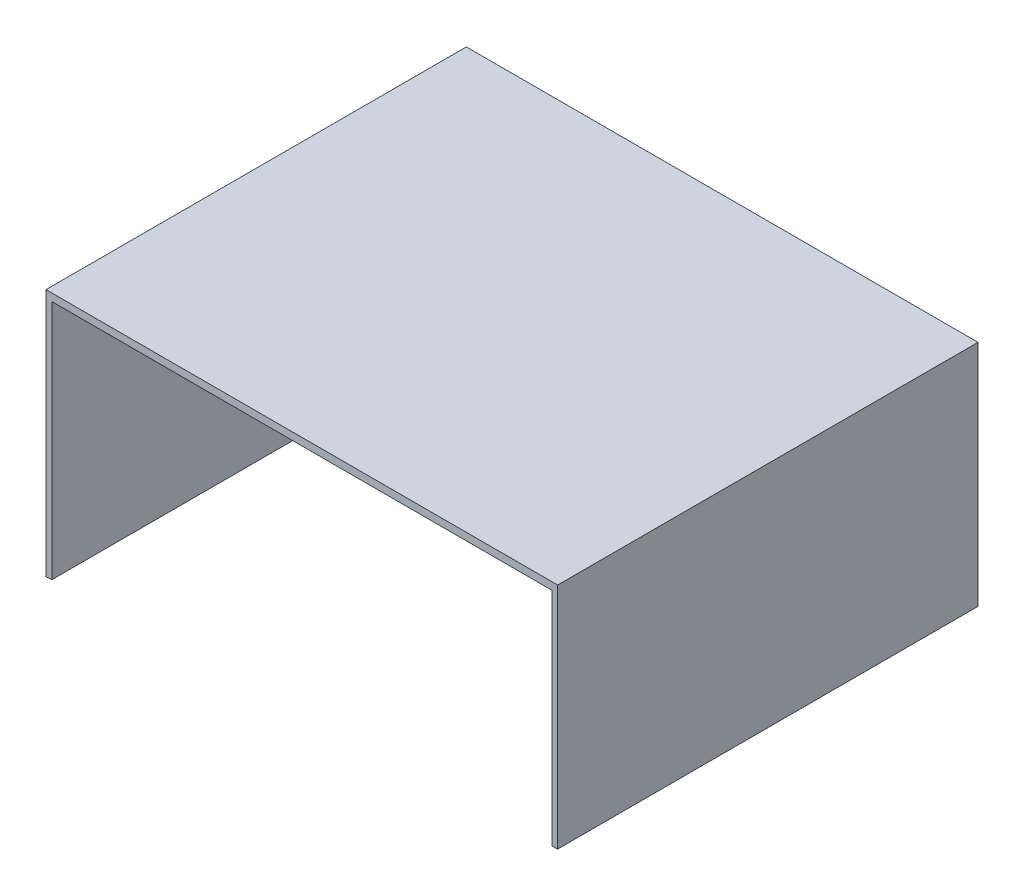
ISO-10303-21;
HEADER;
FILE_DESCRIPTION(('STEP AP214'),'2;1');
FILE_NAME('part.step','',(''),(''),'','','');
FILE_SCHEMA(('AUTOMOTIVE_DESIGN { 1 0 10303 214 1 1 1 1 }'));
ENDSEC;
DATA;
#1=APPLICATION_CONTEXT('core data for automotive mechanical design processes');
#2=APPLICATION_PROTOCOL_DEFINITION('international standard','automotive_design',2000,#1);
#3=PRODUCT_CONTEXT('',#1,'mechanical');
#4=PRODUCT('Part','Part','',(#3));
#5=PRODUCT_RELATED_PRODUCT_CATEGORY('part','',(#4));
#6=PRODUCT_DEFINITION_FORMATION('','',#4);
#7=PRODUCT_DEFINITION_CONTEXT('part definition',#1,'design');
#8=PRODUCT_DEFINITION('design','',#6,#7);
#9=PRODUCT_DEFINITION_SHAPE('','',#8);
#10=(LENGTH_UNIT() NAMED_UNIT(*) SI_UNIT(.MILLI.,.METRE.));
#11=(NAMED_UNIT(*) PLANE_ANGLE_UNIT() SI_UNIT($,.RADIAN.));
#12=(NAMED_UNIT(*) SI_UNIT($,.STERADIAN.) SOLID_ANGLE_UNIT());
#13=UNCERTAINTY_MEASURE_WITH_UNIT(LENGTH_MEASURE(1.E-05),#10,'distance_accuracy_value','');
#14=(GEOMETRIC_REPRESENTATION_CONTEXT(3) GLOBAL_UNCERTAINTY_ASSIGNED_CONTEXT((#13)) GLOBAL_UNIT_ASSIGNED_CONTEXT((#10,
#11,#12)) REPRESENTATION_CONTEXT('',''));
#15=CARTESIAN_POINT('',(0.,0.,0.));
#16=DIRECTION('',(0.,0.,1.));
#17=DIRECTION('',(1.,0.,0.));
#18=AXIS2_PLACEMENT_3D('',#15,#16,#17);
#19=CARTESIAN_POINT('',(-62.8793445920028,-67.8218116653226,216.916));
#20=DIRECTION('',(-0.0389185460102118,0.999242386399041,0.));
#21=DIRECTION('',(-0.999242386399041,-0.0389185460102118,0.));
#22=AXIS2_PLACEMENT_3D('',#19,#20,#21);
#23=PLANE('',#22);
#24=DIRECTION('',(0.999242386399041,0.0389185460102118,0.));
#25=VECTOR('',#24,1.);
#26=CARTESIAN_POINT('',(-62.8793445920028,-67.8218116653226,0.));
#27=LINE('',#26,#25);
#28=CARTESIAN_POINT('',(-65.8607024746265,-67.9379297518921,0.));
#29=VERTEX_POINT('',#28);
#30=CARTESIAN_POINT('',(-62.8793445920028,-67.8218116653226,0.));
#31=VERTEX_POINT('',#30);
#32=EDGE_CURVE('E129',#29,#31,#27,.T.);
#33=ORIENTED_EDGE('',*,*,#32,.T.);
#34=DIRECTION('',(0.,0.,-1.));
#35=VECTOR('',#34,1.);
#36=CARTESIAN_POINT('',(-62.8793445920028,-67.8218116653226,216.916));
#37=LINE('',#36,#35);
#38=CARTESIAN_POINT('',(-62.8793445920028,-67.8218116653226,216.916));
#39=VERTEX_POINT('',#38);
#40=EDGE_CURVE('E11',#39,#31,#37,.T.);
#41=ORIENTED_EDGE('',*,*,#40,.F.);
#42=DIRECTION('',(0.999242386399041,0.0389185460102118,0.));
#43=VECTOR('',#42,1.);
#44=CARTESIAN_POINT('',(-62.8793445920028,-67.8218116653226,216.916));
#45=LINE('',#44,#43);
#46=CARTESIAN_POINT('',(-65.8607024746265,-67.9379297518921,216.916));
#47=VERTEX_POINT('',#46);
#48=EDGE_CURVE('E143',#47,#39,#45,.T.);
#49=ORIENTED_EDGE('',*,*,#48,.F.);
#50=DIRECTION('',(0.,0.,-1.));
#51=VECTOR('',#50,1.);
#52=CARTESIAN_POINT('',(-65.8607024746265,-67.9379297518921,216.916));
#53=LINE('',#52,#51);
#54=EDGE_CURVE('E125',#47,#29,#53,.T.);
#55=ORIENTED_EDGE('',*,*,#54,.T.);
#56=EDGE_LOOP('',(#33,#41,#49,#55));
#57=FACE_BOUND('',#56,.T.);
#58=ADVANCED_FACE('F33',(#57),#23,.F.);
#59=CARTESIAN_POINT('',(-62.8793445920028,56.5215765247411,216.916));
#60=DIRECTION('',(-1.,0.,0.));
#61=DIRECTION('',(0.,0.,1.));
#62=AXIS2_PLACEMENT_3D('',#59,#60,#61);
#63=PLANE('',#62);
#64=DIRECTION('',(0.,1.,0.));
#65=VECTOR('',#64,1.);
#66=CARTESIAN_POINT('',(-62.8793445920028,56.5215765247411,0.));
#67=LINE('',#66,#65);
#68=CARTESIAN_POINT('',(-62.8793445920028,56.5215765247411,0.));
#69=VERTEX_POINT('',#68);
#70=EDGE_CURVE('E132',#31,#69,#67,.T.);
#71=ORIENTED_EDGE('',*,*,#70,.T.);
#72=DIRECTION('',(0.,0.,-1.));
#73=VECTOR('',#72,1.);
#74=CARTESIAN_POINT('',(-62.8793445920028,56.5215765247411,216.916));
#75=LINE('',#74,#73);
#76=CARTESIAN_POINT('',(-62.8793445920028,56.5215765247411,216.916));
#77=VERTEX_POINT('',#76);
#78=EDGE_CURVE('E41',#77,#69,#75,.T.);
#79=ORIENTED_EDGE('',*,*,#78,.F.);
#80=DIRECTION('',(0.,1.,0.));
#81=VECTOR('',#80,1.);
#82=CARTESIAN_POINT('',(-62.8793445920028,56.5215765247411,216.916));
#83=LINE('',#82,#81);
#84=EDGE_CURVE('E92',#39,#77,#83,.T.);
#85=ORIENTED_EDGE('',*,*,#84,.F.);
#86=ORIENTED_EDGE('',*,*,#40,.T.);
#87=EDGE_LOOP('',(#71,#79,#85,#86));
#88=FACE_BOUND('',#87,.T.);
#89=ADVANCED_FACE('F178',(#88),#63,.F.);
#90=CARTESIAN_POINT('',(195.192248234485,56.5215765247411,216.916));
#91=DIRECTION('',(0.,1.,0.));
#92=DIRECTION('',(0.,0.,1.));
#93=AXIS2_PLACEMENT_3D('',#90,#91,#92);
#94=PLANE('',#93);
#95=DIRECTION('',(1.,0.,0.));
#96=VECTOR('',#95,1.);
#97=CARTESIAN_POINT('',(195.192248234485,56.5215765247411,0.));
#98=LINE('',#97,#96);
#99=CARTESIAN_POINT('',(195.192248234485,56.5215765247411,0.));
#100=VERTEX_POINT('',#99);
#101=EDGE_CURVE('E134',#69,#100,#98,.T.);
#102=ORIENTED_EDGE('',*,*,#101,.T.);
#103=DIRECTION('',(0.,0.,-1.));
#104=VECTOR('',#103,1.);
#105=CARTESIAN_POINT('',(195.192248234485,56.5215765247411,216.916));
#106=LINE('',#105,#104);
#107=CARTESIAN_POINT('',(195.192248234485,56.5215765247411,216.916));
#108=VERTEX_POINT('',#107);
#109=EDGE_CURVE('E150',#108,#100,#106,.T.);
#110=ORIENTED_EDGE('',*,*,#109,.F.);
#111=DIRECTION('',(1.,0.,0.));
#112=VECTOR('',#111,1.);
#113=CARTESIAN_POINT('',(195.192248234485,56.5215765247411,216.916));
#114=LINE('',#113,#112);
#115=EDGE_CURVE('E158',#77,#108,#114,.T.);
#116=ORIENTED_EDGE('',*,*,#115,.F.);
#117=ORIENTED_EDGE('',*,*,#78,.T.);
#118=EDGE_LOOP('',(#102,#110,#116,#117));
#119=FACE_BOUND('',#118,.T.);
#120=ADVANCED_FACE('F156',(#119),#94,.F.);
#121=CARTESIAN_POINT('',(195.192248234485,-57.7704254390627,216.916));
#122=DIRECTION('',(1.,0.,0.));
#123=DIRECTION('',(0.,0.,-1.));
#124=AXIS2_PLACEMENT_3D('',#121,#122,#123);
#125=PLANE('',#124);
#126=DIRECTION('',(0.,-1.,0.));
#127=VECTOR('',#126,1.);
#128=CARTESIAN_POINT('',(195.192248234485,-57.7704254390627,0.));
#129=LINE('',#128,#127);
#130=CARTESIAN_POINT('',(195.192248234485,-57.7704254390627,0.));
#131=VERTEX_POINT('',#130);
#132=EDGE_CURVE('E136',#100,#131,#129,.T.);
#133=ORIENTED_EDGE('',*,*,#132,.T.);
#134=DIRECTION('',(0.,0.,-1.));
#135=VECTOR('',#134,1.);
#136=CARTESIAN_POINT('',(195.192248234485,-57.7704254390627,216.916));
#137=LINE('',#136,#135);
#138=CARTESIAN_POINT('',(195.192248234485,-57.7704254390627,216.916));
#139=VERTEX_POINT('',#138);
#140=EDGE_CURVE('E147',#139,#131,#137,.T.);
#141=ORIENTED_EDGE('',*,*,#140,.F.);
#142=DIRECTION('',(0.,-1.,0.));
#143=VECTOR('',#142,1.);
#144=CARTESIAN_POINT('',(195.192248234485,-57.7704254390627,216.916));
#145=LINE('',#144,#143);
#146=EDGE_CURVE('E170',#108,#139,#145,.T.);
#147=ORIENTED_EDGE('',*,*,#146,.F.);
#148=ORIENTED_EDGE('',*,*,#109,.T.);
#149=EDGE_LOOP('',(#133,#141,#147,#148));
#150=FACE_BOUND('',#149,.T.);
#151=ADVANCED_FACE('F166',(#150),#125,.F.);
#152=CARTESIAN_POINT('',(198.173606117109,-57.6543073524932,216.916));
#153=DIRECTION('',(-0.0389185460102118,0.999242386399041,0.));
#154=DIRECTION('',(-0.999242386399041,-0.0389185460102118,0.));
#155=AXIS2_PLACEMENT_3D('',#152,#153,#154);
#156=PLANE('',#155);
#157=DIRECTION('',(0.999242386399041,0.0389185460102118,0.));
#158=VECTOR('',#157,1.);
#159=CARTESIAN_POINT('',(198.173606117109,-57.6543073524932,0.));
#160=LINE('',#159,#158);
#161=CARTESIAN_POINT('',(198.173606117109,-57.6543073524932,0.));
#162=VERTEX_POINT('',#161);
#163=EDGE_CURVE('E138',#131,#162,#160,.T.);
#164=ORIENTED_EDGE('',*,*,#163,.T.);
#165=DIRECTION('',(0.,0.,-1.));
#166=VECTOR('',#165,1.);
#167=CARTESIAN_POINT('',(198.173606117109,-57.6543073524932,216.916));
#168=LINE('',#167,#166);
#169=CARTESIAN_POINT('',(198.173606117109,-57.6543073524932,216.916));
#170=VERTEX_POINT('',#169);
#171=EDGE_CURVE('E120',#170,#162,#168,.T.);
#172=ORIENTED_EDGE('',*,*,#171,.F.);
#173=DIRECTION('',(0.999242386399041,0.0389185460102118,0.));
#174=VECTOR('',#173,1.);
#175=CARTESIAN_POINT('',(198.173606117109,-57.6543073524932,216.916));
#176=LINE('',#175,#174);
#177=EDGE_CURVE('E111',#139,#170,#176,.T.);
#178=ORIENTED_EDGE('',*,*,#177,.F.);
#179=ORIENTED_EDGE('',*,*,#140,.T.);
#180=EDGE_LOOP('',(#164,#172,#178,#179));
#181=FACE_BOUND('',#180,.T.);
#182=ADVANCED_FACE('F169',(#181),#156,.F.);
#183=CARTESIAN_POINT('',(198.173606117109,60.3527805430133,216.916));
#184=DIRECTION('',(-1.,0.,0.));
#185=DIRECTION('',(0.,-1.,0.));
#186=AXIS2_PLACEMENT_3D('',#183,#184,#185);
#187=PLANE('',#186);
#188=DIRECTION('',(0.,1.,0.));
#189=VECTOR('',#188,1.);
#190=CARTESIAN_POINT('',(198.173606117109,60.3527805430133,0.));
#191=LINE('',#190,#189);
#192=CARTESIAN_POINT('',(198.173606117109,60.3527805430133,0.));
#193=VERTEX_POINT('',#192);
#194=EDGE_CURVE('E119',#162,#193,#191,.T.);
#195=ORIENTED_EDGE('',*,*,#194,.T.);
#196=DIRECTION('',(0.,0.,-1.));
#197=VECTOR('',#196,1.);
#198=CARTESIAN_POINT('',(198.173606117109,60.3527805430133,216.916));
#199=LINE('',#198,#197);
#200=CARTESIAN_POINT('',(198.173606117109,60.3527805430133,216.916));
#201=VERTEX_POINT('',#200);
#202=EDGE_CURVE('E116',#201,#193,#199,.T.);
#203=ORIENTED_EDGE('',*,*,#202,.F.);
#204=DIRECTION('',(0.,1.,0.));
#205=VECTOR('',#204,1.);
#206=CARTESIAN_POINT('',(198.173606117109,60.3527805430133,216.916));
#207=LINE('',#206,#205);
#208=EDGE_CURVE('E105',#170,#201,#207,.T.);
#209=ORIENTED_EDGE('',*,*,#208,.F.);
#210=ORIENTED_EDGE('',*,*,#171,.T.);
#211=EDGE_LOOP('',(#195,#203,#209,#210));
#212=FACE_BOUND('',#211,.T.);
#213=ADVANCED_FACE('F117',(#212),#187,.F.);
#214=CARTESIAN_POINT('',(-65.8607024746265,60.3527805430133,216.916));
#215=DIRECTION('',(0.,-1.,0.));
#216=DIRECTION('',(0.,0.,-1.));
#217=AXIS2_PLACEMENT_3D('',#214,#215,#216);
#218=PLANE('',#217);
#219=DIRECTION('',(-1.,0.,0.));
#220=VECTOR('',#219,1.);
#221=CARTESIAN_POINT('',(-65.8607024746265,60.3527805430133,0.));
#222=LINE('',#221,#220);
#223=CARTESIAN_POINT('',(-65.8607024746265,60.3527805430133,0.));
#224=VERTEX_POINT('',#223);
#225=EDGE_CURVE('E78',#193,#224,#222,.T.);
#226=ORIENTED_EDGE('',*,*,#225,.T.);
#227=DIRECTION('',(0.,0.,-1.));
#228=VECTOR('',#227,1.);
#229=CARTESIAN_POINT('',(-65.8607024746265,60.3527805430133,216.916));
#230=LINE('',#229,#228);
#231=CARTESIAN_POINT('',(-65.8607024746265,60.3527805430133,216.916));
#232=VERTEX_POINT('',#231);
#233=EDGE_CURVE('E121',#232,#224,#230,.T.);
#234=ORIENTED_EDGE('',*,*,#233,.F.);
#235=DIRECTION('',(-1.,0.,0.));
#236=VECTOR('',#235,1.);
#237=CARTESIAN_POINT('',(-65.8607024746265,60.3527805430133,216.916));
#238=LINE('',#237,#236);
#239=EDGE_CURVE('E109',#201,#232,#238,.T.);
#240=ORIENTED_EDGE('',*,*,#239,.F.);
#241=ORIENTED_EDGE('',*,*,#202,.T.);
#242=EDGE_LOOP('',(#226,#234,#240,#241));
#243=FACE_BOUND('',#242,.T.);
#244=ADVANCED_FACE('F123',(#243),#218,.F.);
#245=CARTESIAN_POINT('',(-65.8607024746265,-67.9379297518921,216.916));
#246=DIRECTION('',(1.,0.,0.));
#247=DIRECTION('',(0.,0.,-1.));
#248=AXIS2_PLACEMENT_3D('',#245,#246,#247);
#249=PLANE('',#248);
#250=DIRECTION('',(0.,-1.,0.));
#251=VECTOR('',#250,1.);
#252=CARTESIAN_POINT('',(-65.8607024746265,-67.9379297518921,0.));
#253=LINE('',#252,#251);
#254=EDGE_CURVE('E84',#224,#29,#253,.T.);
#255=ORIENTED_EDGE('',*,*,#254,.T.);
#256=ORIENTED_EDGE('',*,*,#54,.F.);
#257=DIRECTION('',(0.,-1.,0.));
#258=VECTOR('',#257,1.);
#259=CARTESIAN_POINT('',(-65.8607024746265,-67.9379297518921,216.916));
#260=LINE('',#259,#258);
#261=EDGE_CURVE('E49',#232,#47,#260,.T.);
#262=ORIENTED_EDGE('',*,*,#261,.F.);
#263=ORIENTED_EDGE('',*,*,#233,.T.);
#264=EDGE_LOOP('',(#255,#256,#262,#263));
#265=FACE_BOUND('',#264,.T.);
#266=ADVANCED_FACE('F194',(#265),#249,.F.);
#267=CARTESIAN_POINT('',(0.,0.,216.916));
#268=DIRECTION('',(0.,0.,-1.));
#269=DIRECTION('',(-1.,0.,0.));
#270=AXIS2_PLACEMENT_3D('',#267,#268,#269);
#271=PLANE('',#270);
#272=ORIENTED_EDGE('',*,*,#48,.T.);
#273=ORIENTED_EDGE('',*,*,#84,.T.);
#274=ORIENTED_EDGE('',*,*,#115,.T.);
#275=ORIENTED_EDGE('',*,*,#146,.T.);
#276=ORIENTED_EDGE('',*,*,#177,.T.);
#277=ORIENTED_EDGE('',*,*,#208,.T.);
#278=ORIENTED_EDGE('',*,*,#239,.T.);
#279=ORIENTED_EDGE('',*,*,#261,.T.);
#280=EDGE_LOOP('',(#272,#273,#274,#275,#276,#277,#278,#279));
#281=FACE_BOUND('',#280,.T.);
#282=ADVANCED_FACE('F107',(#281),#271,.F.);
#283=CARTESIAN_POINT('',(0.,0.,0.));
#284=DIRECTION('',(0.,0.,-1.));
#285=DIRECTION('',(-1.,0.,0.));
#286=AXIS2_PLACEMENT_3D('',#283,#284,#285);
#287=PLANE('',#286);
#288=ORIENTED_EDGE('',*,*,#32,.F.);
#289=ORIENTED_EDGE('',*,*,#254,.F.);
#290=ORIENTED_EDGE('',*,*,#225,.F.);
#291=ORIENTED_EDGE('',*,*,#194,.F.);
#292=ORIENTED_EDGE('',*,*,#163,.F.);
#293=ORIENTED_EDGE('',*,*,#132,.F.);
#294=ORIENTED_EDGE('',*,*,#101,.F.);
#295=ORIENTED_EDGE('',*,*,#70,.F.);
#296=EDGE_LOOP('',(#288,#289,#290,#291,#292,#293,#294,#295));
#297=FACE_BOUND('',#296,.T.);
#298=ADVANCED_FACE('F162',(#297),#287,.T.);
#299=CLOSED_SHELL('',(#58,#89,#120,#151,#182,#213,#244,#266,#282,#298));
#300=MANIFOLD_SOLID_BREP('B2',#299);
#301=ADVANCED_BREP_SHAPE_REPRESENTATION('',(#18,#300),#14);
#302=SHAPE_DEFINITION_REPRESENTATION(#9,#301);
ENDSEC;
END-ISO-10303-21;
